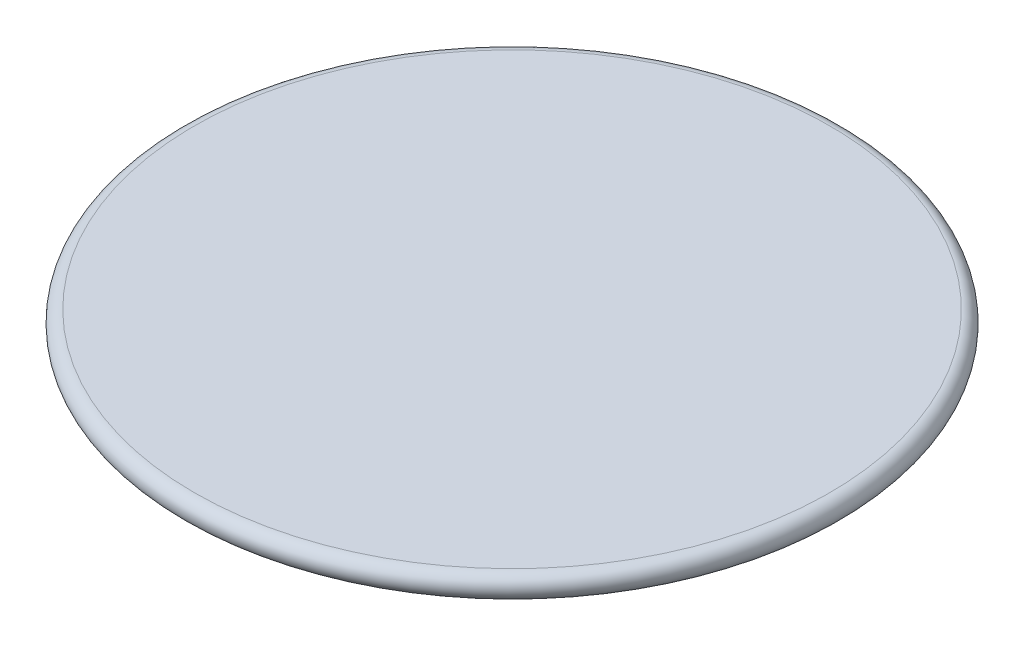
ISO-10303-21;
HEADER;
FILE_DESCRIPTION(('STEP AP214'),'2;1');
FILE_NAME('part.step','',(''),(''),'','','');
FILE_SCHEMA(('AUTOMOTIVE_DESIGN { 1 0 10303 214 1 1 1 1 }'));
ENDSEC;
DATA;
#1=APPLICATION_CONTEXT('core data for automotive mechanical design processes');
#2=APPLICATION_PROTOCOL_DEFINITION('international standard','automotive_design',2000,#1);
#3=PRODUCT_CONTEXT('',#1,'mechanical');
#4=PRODUCT('Part','Part','',(#3));
#5=PRODUCT_RELATED_PRODUCT_CATEGORY('part','',(#4));
#6=PRODUCT_DEFINITION_FORMATION('','',#4);
#7=PRODUCT_DEFINITION_CONTEXT('part definition',#1,'design');
#8=PRODUCT_DEFINITION('design','',#6,#7);
#9=PRODUCT_DEFINITION_SHAPE('','',#8);
#10=(LENGTH_UNIT() NAMED_UNIT(*) SI_UNIT(.MILLI.,.METRE.));
#11=(NAMED_UNIT(*) PLANE_ANGLE_UNIT() SI_UNIT($,.RADIAN.));
#12=(NAMED_UNIT(*) SI_UNIT($,.STERADIAN.) SOLID_ANGLE_UNIT());
#13=UNCERTAINTY_MEASURE_WITH_UNIT(LENGTH_MEASURE(1.E-05),#10,'distance_accuracy_value','');
#14=(GEOMETRIC_REPRESENTATION_CONTEXT(3) GLOBAL_UNCERTAINTY_ASSIGNED_CONTEXT((#13)) GLOBAL_UNIT_ASSIGNED_CONTEXT((#10,
#11,#12)) REPRESENTATION_CONTEXT('',''));
#15=CARTESIAN_POINT('',(0.,0.,0.));
#16=DIRECTION('',(0.,0.,1.));
#17=DIRECTION('',(1.,0.,0.));
#18=AXIS2_PLACEMENT_3D('',#15,#16,#17);
#19=CARTESIAN_POINT('',(0.,0.8,0.));
#20=DIRECTION('',(0.,1.,0.));
#21=DIRECTION('',(0.,0.,1.));
#22=AXIS2_PLACEMENT_3D('',#19,#20,#21);
#23=TOROIDAL_SURFACE('',#22,21.45,0.799999999999999);
#24=CARTESIAN_POINT('',(0.,1.6,0.));
#25=DIRECTION('',(0.,1.,0.));
#26=DIRECTION('',(0.,0.,1.));
#27=AXIS2_PLACEMENT_3D('',#24,#25,#26);
#28=CIRCLE('',#27,21.45);
#29=CARTESIAN_POINT('',(0.,1.6,21.45));
#30=VERTEX_POINT('',#29);
#31=EDGE_CURVE('E40',#30,#30,#28,.T.);
#32=ORIENTED_EDGE('',*,*,#31,.F.);
#33=EDGE_LOOP('',(#32));
#34=FACE_BOUND('',#33,.T.);
#35=CARTESIAN_POINT('',(0.,0.,0.));
#36=DIRECTION('',(0.,1.,0.));
#37=DIRECTION('',(0.,0.,1.));
#38=AXIS2_PLACEMENT_3D('',#35,#36,#37);
#39=CIRCLE('',#38,21.45);
#40=CARTESIAN_POINT('',(0.,0.,21.45));
#41=VERTEX_POINT('',#40);
#42=EDGE_CURVE('E10',#41,#41,#39,.F.);
#43=ORIENTED_EDGE('',*,*,#42,.F.);
#44=EDGE_LOOP('',(#43));
#45=FACE_BOUND('',#44,.T.);
#46=ADVANCED_FACE('F33',(#34,#45),#23,.T.);
#47=CARTESIAN_POINT('',(0.,1.6,0.));
#48=DIRECTION('',(0.,1.,0.));
#49=DIRECTION('',(0.,0.,1.));
#50=AXIS2_PLACEMENT_3D('',#47,#48,#49);
#51=PLANE('',#50);
#52=ORIENTED_EDGE('',*,*,#31,.T.);
#53=EDGE_LOOP('',(#52));
#54=FACE_BOUND('',#53,.T.);
#55=ADVANCED_FACE('F46',(#54),#51,.T.);
#56=CARTESIAN_POINT('',(0.,0.,0.));
#57=DIRECTION('',(0.,1.,0.));
#58=DIRECTION('',(0.,0.,1.));
#59=AXIS2_PLACEMENT_3D('',#56,#57,#58);
#60=PLANE('',#59);
#61=ORIENTED_EDGE('',*,*,#42,.T.);
#62=EDGE_LOOP('',(#61));
#63=FACE_BOUND('',#62,.T.);
#64=ADVANCED_FACE('F53',(#63),#60,.F.);
#65=CLOSED_SHELL('',(#46,#55,#64));
#66=MANIFOLD_SOLID_BREP('B2',#65);
#67=ADVANCED_BREP_SHAPE_REPRESENTATION('',(#18,#66),#14);
#68=SHAPE_DEFINITION_REPRESENTATION(#9,#67);
ENDSEC;
END-ISO-10303-21;
